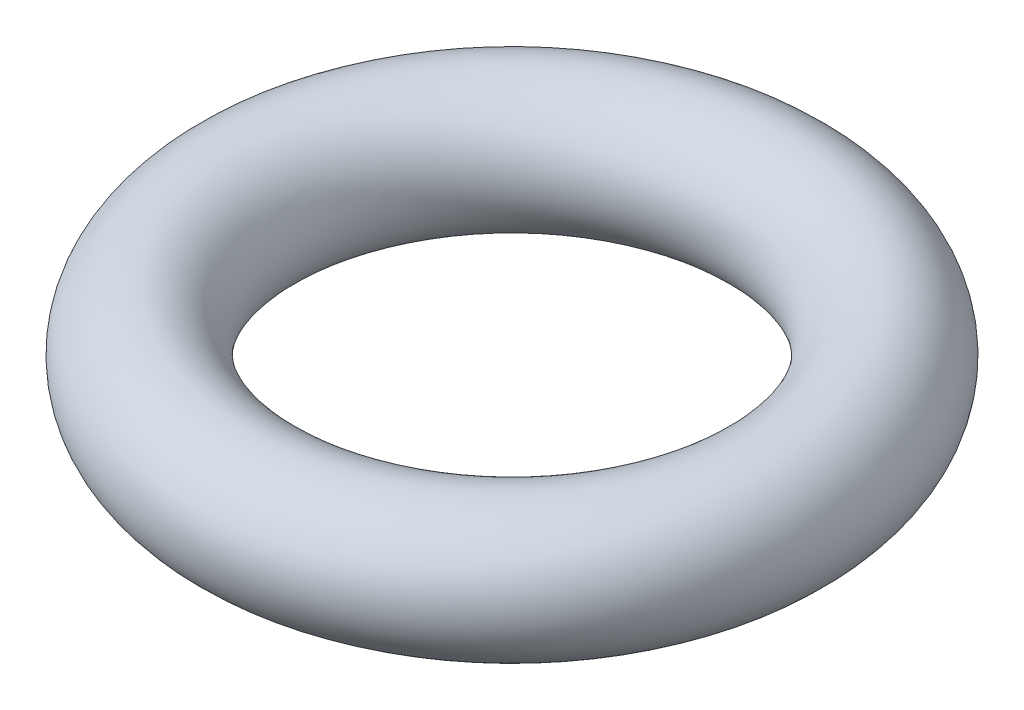
ISO-10303-21;
HEADER;
FILE_DESCRIPTION(('STEP AP214'),'2;1');
FILE_NAME('part.step','',(''),(''),'','','');
FILE_SCHEMA(('AUTOMOTIVE_DESIGN { 1 0 10303 214 1 1 1 1 }'));
ENDSEC;
DATA;
#1=APPLICATION_CONTEXT('core data for automotive mechanical design processes');
#2=APPLICATION_PROTOCOL_DEFINITION('international standard','automotive_design',2000,#1);
#3=PRODUCT_CONTEXT('',#1,'mechanical');
#4=PRODUCT('Part','Part','',(#3));
#5=PRODUCT_RELATED_PRODUCT_CATEGORY('part','',(#4));
#6=PRODUCT_DEFINITION_FORMATION('','',#4);
#7=PRODUCT_DEFINITION_CONTEXT('part definition',#1,'design');
#8=PRODUCT_DEFINITION('design','',#6,#7);
#9=PRODUCT_DEFINITION_SHAPE('','',#8);
#10=(LENGTH_UNIT() NAMED_UNIT(*) SI_UNIT(.MILLI.,.METRE.));
#11=(NAMED_UNIT(*) PLANE_ANGLE_UNIT() SI_UNIT($,.RADIAN.));
#12=(NAMED_UNIT(*) SI_UNIT($,.STERADIAN.) SOLID_ANGLE_UNIT());
#13=UNCERTAINTY_MEASURE_WITH_UNIT(LENGTH_MEASURE(1.E-05),#10,'distance_accuracy_value','');
#14=(GEOMETRIC_REPRESENTATION_CONTEXT(3) GLOBAL_UNCERTAINTY_ASSIGNED_CONTEXT((#13)) GLOBAL_UNIT_ASSIGNED_CONTEXT((#10,
#11,#12)) REPRESENTATION_CONTEXT('',''));
#15=CARTESIAN_POINT('',(0.,0.,0.));
#16=DIRECTION('',(0.,0.,1.));
#17=DIRECTION('',(1.,0.,0.));
#18=AXIS2_PLACEMENT_3D('',#15,#16,#17);
#19=CARTESIAN_POINT('',(0.,12.7,0.));
#20=DIRECTION('',(0.,-1.,0.));
#21=DIRECTION('',(0.,0.,-1.));
#22=AXIS2_PLACEMENT_3D('',#19,#20,#21);
#23=TOROIDAL_SURFACE('',#22,50.8,12.7);
#24=CARTESIAN_POINT('',(0.,12.7,-63.5));
#25=VERTEX_POINT('',#24);
#26=VERTEX_LOOP('',#25);
#27=FACE_BOUND('',#26,.T.);
#28=ADVANCED_FACE('F37',(#27),#23,.T.);
#29=CLOSED_SHELL('',(#28));
#30=MANIFOLD_SOLID_BREP('B2',#29);
#31=ADVANCED_BREP_SHAPE_REPRESENTATION('',(#18,#30),#14);
#32=SHAPE_DEFINITION_REPRESENTATION(#9,#31);
ENDSEC;
END-ISO-10303-21;
